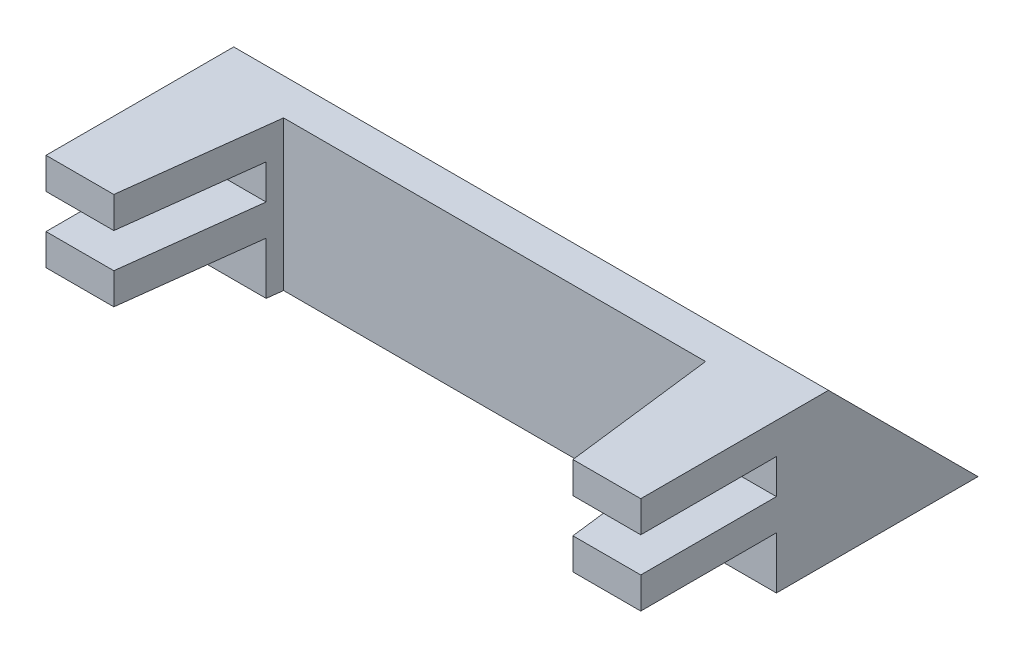
ISO-10303-21;
HEADER;
FILE_DESCRIPTION(('STEP AP214'),'2;1');
FILE_NAME('part.step','',(''),(''),'','','');
FILE_SCHEMA(('AUTOMOTIVE_DESIGN { 1 0 10303 214 1 1 1 1 }'));
ENDSEC;
DATA;
#1=APPLICATION_CONTEXT('core data for automotive mechanical design processes');
#2=APPLICATION_PROTOCOL_DEFINITION('international standard','automotive_design',2000,#1);
#3=PRODUCT_CONTEXT('',#1,'mechanical');
#4=PRODUCT('Part','Part','',(#3));
#5=PRODUCT_RELATED_PRODUCT_CATEGORY('part','',(#4));
#6=PRODUCT_DEFINITION_FORMATION('','',#4);
#7=PRODUCT_DEFINITION_CONTEXT('part definition',#1,'design');
#8=PRODUCT_DEFINITION('design','',#6,#7);
#9=PRODUCT_DEFINITION_SHAPE('','',#8);
#10=(LENGTH_UNIT() NAMED_UNIT(*) SI_UNIT(.MILLI.,.METRE.));
#11=(NAMED_UNIT(*) PLANE_ANGLE_UNIT() SI_UNIT($,.RADIAN.));
#12=(NAMED_UNIT(*) SI_UNIT($,.STERADIAN.) SOLID_ANGLE_UNIT());
#13=UNCERTAINTY_MEASURE_WITH_UNIT(LENGTH_MEASURE(1.E-05),#10,'distance_accuracy_value','');
#14=(GEOMETRIC_REPRESENTATION_CONTEXT(3) GLOBAL_UNCERTAINTY_ASSIGNED_CONTEXT((#13)) GLOBAL_UNIT_ASSIGNED_CONTEXT((#10,
#11,#12)) REPRESENTATION_CONTEXT('',''));
#15=CARTESIAN_POINT('',(0.,0.,0.));
#16=DIRECTION('',(0.,0.,1.));
#17=DIRECTION('',(1.,0.,0.));
#18=AXIS2_PLACEMENT_3D('',#15,#16,#17);
#19=CARTESIAN_POINT('',(-57.,5.,0.));
#20=DIRECTION('',(0.,0.,1.));
#21=DIRECTION('',(0.,-1.,0.));
#22=AXIS2_PLACEMENT_3D('',#19,#20,#21);
#23=PLANE('',#22);
#24=DIRECTION('',(0.,1.,0.));
#25=VECTOR('',#24,1.);
#26=CARTESIAN_POINT('',(-48.9038007082622,-0.00100000000000299,0.));
#27=LINE('',#26,#25);
#28=CARTESIAN_POINT('',(-48.9038007082622,0.,0.));
#29=VERTEX_POINT('',#28);
#30=CARTESIAN_POINT('',(-48.9038007082622,5.,0.));
#31=VERTEX_POINT('',#30);
#32=EDGE_CURVE('E360',#29,#31,#27,.T.);
#33=ORIENTED_EDGE('',*,*,#32,.T.);
#34=DIRECTION('',(1.,0.,0.));
#35=VECTOR('',#34,1.);
#36=CARTESIAN_POINT('',(-57.,5.,0.));
#37=LINE('',#36,#35);
#38=CARTESIAN_POINT('',(-57.,5.,0.));
#39=VERTEX_POINT('',#38);
#40=EDGE_CURVE('E198',#39,#31,#37,.T.);
#41=ORIENTED_EDGE('',*,*,#40,.F.);
#42=DIRECTION('',(0.,-1.,0.));
#43=VECTOR('',#42,1.);
#44=CARTESIAN_POINT('',(-57.,5.,0.));
#45=LINE('',#44,#43);
#46=CARTESIAN_POINT('',(-57.,0.,0.));
#47=VERTEX_POINT('',#46);
#48=EDGE_CURVE('E154',#39,#47,#45,.T.);
#49=ORIENTED_EDGE('',*,*,#48,.T.);
#50=DIRECTION('',(1.,0.,0.));
#51=VECTOR('',#50,1.);
#52=CARTESIAN_POINT('',(-57.,0.,0.));
#53=LINE('',#52,#51);
#54=EDGE_CURVE('E11',#47,#29,#53,.T.);
#55=ORIENTED_EDGE('',*,*,#54,.T.);
#56=EDGE_LOOP('',(#33,#41,#49,#55));
#57=FACE_BOUND('',#56,.T.);
#58=ADVANCED_FACE('F35',(#57),#23,.T.);
#59=CARTESIAN_POINT('',(-57.,5.,13.));
#60=DIRECTION('',(0.,-1.,0.));
#61=DIRECTION('',(0.,0.,-1.));
#62=AXIS2_PLACEMENT_3D('',#59,#60,#61);
#63=PLANE('',#62);
#64=DIRECTION('',(-0.121869343405151,0.,0.992546151641322));
#65=VECTOR('',#64,1.);
#66=CARTESIAN_POINT('',(-48.7208517125169,5.,-1.48999999999984));
#67=LINE('',#66,#65);
#68=CARTESIAN_POINT('',(-50.5,5.,13.));
#69=VERTEX_POINT('',#68);
#70=EDGE_CURVE('E140',#31,#69,#67,.T.);
#71=ORIENTED_EDGE('',*,*,#70,.T.);
#72=DIRECTION('',(1.,0.,0.));
#73=VECTOR('',#72,1.);
#74=CARTESIAN_POINT('',(-57.,5.,13.));
#75=LINE('',#74,#73);
#76=CARTESIAN_POINT('',(-57.,5.,13.));
#77=VERTEX_POINT('',#76);
#78=EDGE_CURVE('E132',#77,#69,#75,.T.);
#79=ORIENTED_EDGE('',*,*,#78,.F.);
#80=DIRECTION('',(0.,0.,-1.));
#81=VECTOR('',#80,1.);
#82=CARTESIAN_POINT('',(-57.,5.,13.));
#83=LINE('',#82,#81);
#84=EDGE_CURVE('E136',#77,#39,#83,.T.);
#85=ORIENTED_EDGE('',*,*,#84,.T.);
#86=ORIENTED_EDGE('',*,*,#40,.T.);
#87=EDGE_LOOP('',(#71,#79,#85,#86));
#88=FACE_BOUND('',#87,.T.);
#89=ADVANCED_FACE('F134',(#88),#63,.T.);
#90=CARTESIAN_POINT('',(-57.,8.,13.));
#91=DIRECTION('',(0.,0.,1.));
#92=DIRECTION('',(0.,-1.,0.));
#93=AXIS2_PLACEMENT_3D('',#90,#91,#92);
#94=PLANE('',#93);
#95=DIRECTION('',(0.,1.,0.));
#96=VECTOR('',#95,1.);
#97=CARTESIAN_POINT('',(-50.5,-0.00100000000000447,13.));
#98=LINE('',#97,#96);
#99=CARTESIAN_POINT('',(-50.5,8.,13.));
#100=VERTEX_POINT('',#99);
#101=EDGE_CURVE('E332',#69,#100,#98,.T.);
#102=ORIENTED_EDGE('',*,*,#101,.T.);
#103=DIRECTION('',(1.,0.,0.));
#104=VECTOR('',#103,1.);
#105=CARTESIAN_POINT('',(-57.,8.,13.));
#106=LINE('',#105,#104);
#107=CARTESIAN_POINT('',(-57.,8.,13.));
#108=VERTEX_POINT('',#107);
#109=EDGE_CURVE('E158',#108,#100,#106,.T.);
#110=ORIENTED_EDGE('',*,*,#109,.F.);
#111=DIRECTION('',(0.,-1.,0.));
#112=VECTOR('',#111,1.);
#113=CARTESIAN_POINT('',(-57.,8.,13.));
#114=LINE('',#113,#112);
#115=EDGE_CURVE('E151',#108,#77,#114,.T.);
#116=ORIENTED_EDGE('',*,*,#115,.T.);
#117=ORIENTED_EDGE('',*,*,#78,.T.);
#118=EDGE_LOOP('',(#102,#110,#116,#117));
#119=FACE_BOUND('',#118,.T.);
#120=ADVANCED_FACE('F156',(#119),#94,.T.);
#121=CARTESIAN_POINT('',(-57.,8.,0.));
#122=DIRECTION('',(0.,1.,0.));
#123=DIRECTION('',(0.,0.,1.));
#124=AXIS2_PLACEMENT_3D('',#121,#122,#123);
#125=PLANE('',#124);
#126=DIRECTION('',(0.121869343405151,0.,-0.992546151641322));
#127=VECTOR('',#126,1.);
#128=CARTESIAN_POINT('',(-48.7208517125169,8.,-1.48999999999984));
#129=LINE('',#128,#127);
#130=CARTESIAN_POINT('',(-48.9038007082622,8.,0.));
#131=VERTEX_POINT('',#130);
#132=EDGE_CURVE('E364',#100,#131,#129,.T.);
#133=ORIENTED_EDGE('',*,*,#132,.T.);
#134=DIRECTION('',(1.,0.,0.));
#135=VECTOR('',#134,1.);
#136=CARTESIAN_POINT('',(-57.,8.,0.));
#137=LINE('',#136,#135);
#138=CARTESIAN_POINT('',(-57.,8.,0.));
#139=VERTEX_POINT('',#138);
#140=EDGE_CURVE('E202',#139,#131,#137,.T.);
#141=ORIENTED_EDGE('',*,*,#140,.F.);
#142=DIRECTION('',(0.,0.,1.));
#143=VECTOR('',#142,1.);
#144=CARTESIAN_POINT('',(-57.,8.,0.));
#145=LINE('',#144,#143);
#146=EDGE_CURVE('E159',#139,#108,#145,.T.);
#147=ORIENTED_EDGE('',*,*,#146,.T.);
#148=ORIENTED_EDGE('',*,*,#109,.T.);
#149=EDGE_LOOP('',(#133,#141,#147,#148));
#150=FACE_BOUND('',#149,.T.);
#151=ADVANCED_FACE('F371',(#150),#125,.T.);
#152=CARTESIAN_POINT('',(-57.,11.33,0.));
#153=DIRECTION('',(0.,0.,1.));
#154=DIRECTION('',(0.,-1.,0.));
#155=AXIS2_PLACEMENT_3D('',#152,#153,#154);
#156=PLANE('',#155);
#157=DIRECTION('',(0.,1.,0.));
#158=VECTOR('',#157,1.);
#159=CARTESIAN_POINT('',(-48.9038007082622,-0.00100000000000292,0.));
#160=LINE('',#159,#158);
#161=CARTESIAN_POINT('',(-48.9038007082622,11.33,0.));
#162=VERTEX_POINT('',#161);
#163=EDGE_CURVE('E367',#131,#162,#160,.T.);
#164=ORIENTED_EDGE('',*,*,#163,.T.);
#165=DIRECTION('',(1.,0.,0.));
#166=VECTOR('',#165,1.);
#167=CARTESIAN_POINT('',(-57.,11.33,0.));
#168=LINE('',#167,#166);
#169=CARTESIAN_POINT('',(-57.,11.33,0.));
#170=VERTEX_POINT('',#169);
#171=EDGE_CURVE('E206',#170,#162,#168,.T.);
#172=ORIENTED_EDGE('',*,*,#171,.F.);
#173=DIRECTION('',(0.,-1.,0.));
#174=VECTOR('',#173,1.);
#175=CARTESIAN_POINT('',(-57.,11.33,0.));
#176=LINE('',#175,#174);
#177=EDGE_CURVE('E161',#170,#139,#176,.T.);
#178=ORIENTED_EDGE('',*,*,#177,.T.);
#179=ORIENTED_EDGE('',*,*,#140,.T.);
#180=EDGE_LOOP('',(#164,#172,#178,#179));
#181=FACE_BOUND('',#180,.T.);
#182=ADVANCED_FACE('F263',(#181),#156,.T.);
#183=CARTESIAN_POINT('',(-57.,11.33,13.));
#184=DIRECTION('',(0.,-1.,0.));
#185=DIRECTION('',(0.,0.,-1.));
#186=AXIS2_PLACEMENT_3D('',#183,#184,#185);
#187=PLANE('',#186);
#188=DIRECTION('',(-0.121869343405151,0.,0.992546151641322));
#189=VECTOR('',#188,1.);
#190=CARTESIAN_POINT('',(-48.7208517125169,11.33,-1.48999999999984));
#191=LINE('',#190,#189);
#192=CARTESIAN_POINT('',(-50.5,11.33,13.));
#193=VERTEX_POINT('',#192);
#194=EDGE_CURVE('E273',#162,#193,#191,.T.);
#195=ORIENTED_EDGE('',*,*,#194,.T.);
#196=DIRECTION('',(1.,0.,0.));
#197=VECTOR('',#196,1.);
#198=CARTESIAN_POINT('',(-57.,11.33,13.));
#199=LINE('',#198,#197);
#200=CARTESIAN_POINT('',(-57.,11.33,13.));
#201=VERTEX_POINT('',#200);
#202=EDGE_CURVE('E210',#201,#193,#199,.T.);
#203=ORIENTED_EDGE('',*,*,#202,.F.);
#204=DIRECTION('',(0.,0.,-1.));
#205=VECTOR('',#204,1.);
#206=CARTESIAN_POINT('',(-57.,11.33,13.));
#207=LINE('',#206,#205);
#208=EDGE_CURVE('E257',#201,#170,#207,.T.);
#209=ORIENTED_EDGE('',*,*,#208,.T.);
#210=ORIENTED_EDGE('',*,*,#171,.T.);
#211=EDGE_LOOP('',(#195,#203,#209,#210));
#212=FACE_BOUND('',#211,.T.);
#213=ADVANCED_FACE('F269',(#212),#187,.T.);
#214=CARTESIAN_POINT('',(-57.,14.33,13.));
#215=DIRECTION('',(0.,0.,1.));
#216=DIRECTION('',(1.,0.,0.));
#217=AXIS2_PLACEMENT_3D('',#214,#215,#216);
#218=PLANE('',#217);
#219=CARTESIAN_POINT('',(-50.5,14.33,13.));
#220=VERTEX_POINT('',#219);
#221=EDGE_CURVE('E279',#193,#220,#98,.T.);
#222=ORIENTED_EDGE('',*,*,#221,.T.);
#223=DIRECTION('',(1.,0.,0.));
#224=VECTOR('',#223,1.);
#225=CARTESIAN_POINT('',(-57.,14.33,13.));
#226=LINE('',#225,#224);
#227=CARTESIAN_POINT('',(-57.,14.33,13.));
#228=VERTEX_POINT('',#227);
#229=EDGE_CURVE('E214',#228,#220,#226,.T.);
#230=ORIENTED_EDGE('',*,*,#229,.F.);
#231=DIRECTION('',(0.,-1.,0.));
#232=VECTOR('',#231,1.);
#233=CARTESIAN_POINT('',(-57.,14.33,13.));
#234=LINE('',#233,#232);
#235=EDGE_CURVE('E254',#228,#201,#234,.T.);
#236=ORIENTED_EDGE('',*,*,#235,.T.);
#237=ORIENTED_EDGE('',*,*,#202,.T.);
#238=EDGE_LOOP('',(#222,#230,#236,#237));
#239=FACE_BOUND('',#238,.T.);
#240=ADVANCED_FACE('F276',(#239),#218,.T.);
#241=CARTESIAN_POINT('',(-57.,0.,0.));
#242=DIRECTION('',(0.,-1.,0.));
#243=DIRECTION('',(0.,0.,-1.));
#244=AXIS2_PLACEMENT_3D('',#241,#242,#243);
#245=PLANE('',#244);
#246=DIRECTION('',(-0.121869343405151,0.,0.992546151641322));
#247=VECTOR('',#246,1.);
#248=CARTESIAN_POINT('',(-48.7208517125169,0.,-1.48999999999984));
#249=LINE('',#248,#247);
#250=CARTESIAN_POINT('',(-48.7208517125169,0.,-1.48999999999984));
#251=VERTEX_POINT('',#250);
#252=EDGE_CURVE('E355',#251,#29,#249,.T.);
#253=ORIENTED_EDGE('',*,*,#252,.T.);
#254=ORIENTED_EDGE('',*,*,#54,.F.);
#255=DIRECTION('',(0.,0.,-1.));
#256=VECTOR('',#255,1.);
#257=CARTESIAN_POINT('',(-57.,0.,0.));
#258=LINE('',#257,#256);
#259=CARTESIAN_POINT('',(-57.,0.,-19.32));
#260=VERTEX_POINT('',#259);
#261=EDGE_CURVE('E196',#47,#260,#258,.T.);
#262=ORIENTED_EDGE('',*,*,#261,.T.);
#263=DIRECTION('',(1.,0.,0.));
#264=VECTOR('',#263,1.);
#265=CARTESIAN_POINT('',(-57.,0.,-19.32));
#266=LINE('',#265,#264);
#267=CARTESIAN_POINT('',(0.,0.,-19.32));
#268=VERTEX_POINT('',#267);
#269=EDGE_CURVE('E39',#260,#268,#266,.T.);
#270=ORIENTED_EDGE('',*,*,#269,.T.);
#271=DIRECTION('',(0.,0.,-1.));
#272=VECTOR('',#271,1.);
#273=CARTESIAN_POINT('',(0.,0.,0.));
#274=LINE('',#273,#272);
#275=CARTESIAN_POINT('',(0.,0.,0.));
#276=VERTEX_POINT('',#275);
#277=EDGE_CURVE('E166',#276,#268,#274,.T.);
#278=ORIENTED_EDGE('',*,*,#277,.F.);
#279=CARTESIAN_POINT('',(-8.09619929173782,0.,0.));
#280=VERTEX_POINT('',#279);
#281=EDGE_CURVE('E44',#280,#276,#53,.T.);
#282=ORIENTED_EDGE('',*,*,#281,.F.);
#283=DIRECTION('',(-0.121869343405151,0.,-0.992546151641322));
#284=VECTOR('',#283,1.);
#285=CARTESIAN_POINT('',(-6.5,0.,13.));
#286=LINE('',#285,#284);
#287=CARTESIAN_POINT('',(-8.27914828748312,0.,-1.48999999999984));
#288=VERTEX_POINT('',#287);
#289=EDGE_CURVE('E170',#280,#288,#286,.T.);
#290=ORIENTED_EDGE('',*,*,#289,.T.);
#291=DIRECTION('',(-1.,0.,0.));
#292=VECTOR('',#291,1.);
#293=CARTESIAN_POINT('',(-8.27914828748312,0.,-1.48999999999984));
#294=LINE('',#293,#292);
#295=EDGE_CURVE('E357',#288,#251,#294,.T.);
#296=ORIENTED_EDGE('',*,*,#295,.T.);
#297=EDGE_LOOP('',(#253,#254,#262,#270,#278,#282,#290,#296));
#298=FACE_BOUND('',#297,.T.);
#299=ADVANCED_FACE('F37',(#298),#245,.T.);
#300=DIRECTION('',(0.,-1.,0.));
#301=VECTOR('',#300,1.);
#302=CARTESIAN_POINT('',(-8.09619929173781,-0.00100000000000224,0.));
#303=LINE('',#302,#301);
#304=CARTESIAN_POINT('',(-8.09619929173781,5.,0.));
#305=VERTEX_POINT('',#304);
#306=EDGE_CURVE('E227',#305,#280,#303,.T.);
#307=ORIENTED_EDGE('',*,*,#306,.T.);
#308=ORIENTED_EDGE('',*,*,#281,.T.);
#309=DIRECTION('',(0.,-1.,0.));
#310=VECTOR('',#309,1.);
#311=CARTESIAN_POINT('',(0.,5.,0.));
#312=LINE('',#311,#310);
#313=CARTESIAN_POINT('',(0.,5.,0.));
#314=VERTEX_POINT('',#313);
#315=EDGE_CURVE('E194',#314,#276,#312,.T.);
#316=ORIENTED_EDGE('',*,*,#315,.F.);
#317=EDGE_CURVE('E144',#305,#314,#37,.T.);
#318=ORIENTED_EDGE('',*,*,#317,.F.);
#319=EDGE_LOOP('',(#307,#308,#316,#318));
#320=FACE_BOUND('',#319,.T.);
#321=ADVANCED_FACE('F224',(#320),#23,.T.);
#322=DIRECTION('',(-0.121869343405151,0.,-0.992546151641322));
#323=VECTOR('',#322,1.);
#324=CARTESIAN_POINT('',(-6.5,5.,13.));
#325=LINE('',#324,#323);
#326=CARTESIAN_POINT('',(-6.50000000000001,5.,13.));
#327=VERTEX_POINT('',#326);
#328=EDGE_CURVE('E234',#327,#305,#325,.T.);
#329=ORIENTED_EDGE('',*,*,#328,.T.);
#330=ORIENTED_EDGE('',*,*,#317,.T.);
#331=DIRECTION('',(0.,0.,-1.));
#332=VECTOR('',#331,1.);
#333=CARTESIAN_POINT('',(0.,5.,13.));
#334=LINE('',#333,#332);
#335=CARTESIAN_POINT('',(0.,5.,13.));
#336=VERTEX_POINT('',#335);
#337=EDGE_CURVE('E191',#336,#314,#334,.T.);
#338=ORIENTED_EDGE('',*,*,#337,.F.);
#339=EDGE_CURVE('E145',#327,#336,#75,.T.);
#340=ORIENTED_EDGE('',*,*,#339,.F.);
#341=EDGE_LOOP('',(#329,#330,#338,#340));
#342=FACE_BOUND('',#341,.T.);
#343=ADVANCED_FACE('F231',(#342),#63,.T.);
#344=DIRECTION('',(0.,1.,0.));
#345=VECTOR('',#344,1.);
#346=CARTESIAN_POINT('',(-6.5,-0.00100000000000447,13.));
#347=LINE('',#346,#345);
#348=CARTESIAN_POINT('',(-6.5,8.,13.));
#349=VERTEX_POINT('',#348);
#350=EDGE_CURVE('E340',#327,#349,#347,.T.);
#351=ORIENTED_EDGE('',*,*,#350,.F.);
#352=ORIENTED_EDGE('',*,*,#339,.T.);
#353=DIRECTION('',(0.,-1.,0.));
#354=VECTOR('',#353,1.);
#355=CARTESIAN_POINT('',(0.,8.,13.));
#356=LINE('',#355,#354);
#357=CARTESIAN_POINT('',(0.,8.,13.));
#358=VERTEX_POINT('',#357);
#359=EDGE_CURVE('E188',#358,#336,#356,.T.);
#360=ORIENTED_EDGE('',*,*,#359,.F.);
#361=EDGE_CURVE('E201',#349,#358,#106,.T.);
#362=ORIENTED_EDGE('',*,*,#361,.F.);
#363=EDGE_LOOP('',(#351,#352,#360,#362));
#364=FACE_BOUND('',#363,.T.);
#365=ADVANCED_FACE('F381',(#364),#94,.T.);
#366=DIRECTION('',(0.121869343405151,0.,0.992546151641322));
#367=VECTOR('',#366,1.);
#368=CARTESIAN_POINT('',(-6.5,8.,13.));
#369=LINE('',#368,#367);
#370=CARTESIAN_POINT('',(-8.09619929173782,8.,0.));
#371=VERTEX_POINT('',#370);
#372=EDGE_CURVE('E238',#371,#349,#369,.T.);
#373=ORIENTED_EDGE('',*,*,#372,.T.);
#374=ORIENTED_EDGE('',*,*,#361,.T.);
#375=DIRECTION('',(0.,0.,1.));
#376=VECTOR('',#375,1.);
#377=CARTESIAN_POINT('',(0.,8.,0.));
#378=LINE('',#377,#376);
#379=CARTESIAN_POINT('',(0.,8.,0.));
#380=VERTEX_POINT('',#379);
#381=EDGE_CURVE('E185',#380,#358,#378,.T.);
#382=ORIENTED_EDGE('',*,*,#381,.F.);
#383=EDGE_CURVE('E205',#371,#380,#137,.T.);
#384=ORIENTED_EDGE('',*,*,#383,.F.);
#385=EDGE_LOOP('',(#373,#374,#382,#384));
#386=FACE_BOUND('',#385,.T.);
#387=ADVANCED_FACE('F374',(#386),#125,.T.);
#388=DIRECTION('',(0.,-1.,0.));
#389=VECTOR('',#388,1.);
#390=CARTESIAN_POINT('',(-8.09619929173781,-0.00100000000000289,0.));
#391=LINE('',#390,#389);
#392=CARTESIAN_POINT('',(-8.09619929173781,11.33,0.));
#393=VERTEX_POINT('',#392);
#394=EDGE_CURVE('E242',#393,#371,#391,.T.);
#395=ORIENTED_EDGE('',*,*,#394,.T.);
#396=ORIENTED_EDGE('',*,*,#383,.T.);
#397=DIRECTION('',(0.,-1.,0.));
#398=VECTOR('',#397,1.);
#399=CARTESIAN_POINT('',(0.,11.33,0.));
#400=LINE('',#399,#398);
#401=CARTESIAN_POINT('',(0.,11.33,0.));
#402=VERTEX_POINT('',#401);
#403=EDGE_CURVE('E182',#402,#380,#400,.T.);
#404=ORIENTED_EDGE('',*,*,#403,.F.);
#405=EDGE_CURVE('E209',#393,#402,#168,.T.);
#406=ORIENTED_EDGE('',*,*,#405,.F.);
#407=EDGE_LOOP('',(#395,#396,#404,#406));
#408=FACE_BOUND('',#407,.T.);
#409=ADVANCED_FACE('F334',(#408),#156,.T.);
#410=DIRECTION('',(-0.121869343405151,0.,-0.992546151641322));
#411=VECTOR('',#410,1.);
#412=CARTESIAN_POINT('',(-6.5,11.33,13.));
#413=LINE('',#412,#411);
#414=CARTESIAN_POINT('',(-6.50000000000001,11.33,13.));
#415=VERTEX_POINT('',#414);
#416=EDGE_CURVE('E323',#415,#393,#413,.T.);
#417=ORIENTED_EDGE('',*,*,#416,.T.);
#418=ORIENTED_EDGE('',*,*,#405,.T.);
#419=DIRECTION('',(0.,0.,-1.));
#420=VECTOR('',#419,1.);
#421=CARTESIAN_POINT('',(0.,11.33,13.));
#422=LINE('',#421,#420);
#423=CARTESIAN_POINT('',(0.,11.33,13.));
#424=VERTEX_POINT('',#423);
#425=EDGE_CURVE('E179',#424,#402,#422,.T.);
#426=ORIENTED_EDGE('',*,*,#425,.F.);
#427=EDGE_CURVE('E213',#415,#424,#199,.T.);
#428=ORIENTED_EDGE('',*,*,#427,.F.);
#429=EDGE_LOOP('',(#417,#418,#426,#428));
#430=FACE_BOUND('',#429,.T.);
#431=ADVANCED_FACE('F329',(#430),#187,.T.);
#432=CARTESIAN_POINT('',(-6.50000000000001,14.33,13.));
#433=VERTEX_POINT('',#432);
#434=EDGE_CURVE('E52',#415,#433,#347,.T.);
#435=ORIENTED_EDGE('',*,*,#434,.F.);
#436=ORIENTED_EDGE('',*,*,#427,.T.);
#437=DIRECTION('',(0.,-1.,0.));
#438=VECTOR('',#437,1.);
#439=CARTESIAN_POINT('',(0.,14.33,13.));
#440=LINE('',#439,#438);
#441=CARTESIAN_POINT('',(0.,14.33,13.));
#442=VERTEX_POINT('',#441);
#443=EDGE_CURVE('E176',#442,#424,#440,.T.);
#444=ORIENTED_EDGE('',*,*,#443,.F.);
#445=EDGE_CURVE('E216',#433,#442,#226,.T.);
#446=ORIENTED_EDGE('',*,*,#445,.F.);
#447=EDGE_LOOP('',(#435,#436,#444,#446));
#448=FACE_BOUND('',#447,.T.);
#449=ADVANCED_FACE('F339',(#448),#218,.T.);
#450=CARTESIAN_POINT('',(-57.,14.33,-4.98999999999984));
#451=DIRECTION('',(0.,1.,0.));
#452=DIRECTION('',(0.,0.,1.));
#453=AXIS2_PLACEMENT_3D('',#450,#451,#452);
#454=PLANE('',#453);
#455=DIRECTION('',(-0.121869343405151,0.,0.992546151641322));
#456=VECTOR('',#455,1.);
#457=CARTESIAN_POINT('',(-48.7208517125169,14.33,-1.48999999999983));
#458=LINE('',#457,#456);
#459=CARTESIAN_POINT('',(-48.7208517125169,14.33,-1.48999999999983));
#460=VERTEX_POINT('',#459);
#461=EDGE_CURVE('E341',#460,#220,#458,.T.);
#462=ORIENTED_EDGE('',*,*,#461,.F.);
#463=DIRECTION('',(-1.,0.,0.));
#464=VECTOR('',#463,1.);
#465=CARTESIAN_POINT('',(-8.27914828748312,14.33,-1.48999999999983));
#466=LINE('',#465,#464);
#467=CARTESIAN_POINT('',(-8.27914828748312,14.33,-1.48999999999983));
#468=VERTEX_POINT('',#467);
#469=EDGE_CURVE('E344',#468,#460,#466,.T.);
#470=ORIENTED_EDGE('',*,*,#469,.F.);
#471=DIRECTION('',(-0.121869343405151,0.,-0.992546151641322));
#472=VECTOR('',#471,1.);
#473=CARTESIAN_POINT('',(-6.5,14.33,13.));
#474=LINE('',#473,#472);
#475=EDGE_CURVE('E353',#433,#468,#474,.T.);
#476=ORIENTED_EDGE('',*,*,#475,.F.);
#477=ORIENTED_EDGE('',*,*,#445,.T.);
#478=DIRECTION('',(0.,0.,1.));
#479=VECTOR('',#478,1.);
#480=CARTESIAN_POINT('',(0.,14.33,-4.98999999999984));
#481=LINE('',#480,#479);
#482=CARTESIAN_POINT('',(0.,14.33,-4.98999999999984));
#483=VERTEX_POINT('',#482);
#484=EDGE_CURVE('E173',#483,#442,#481,.T.);
#485=ORIENTED_EDGE('',*,*,#484,.F.);
#486=DIRECTION('',(1.,0.,0.));
#487=VECTOR('',#486,1.);
#488=CARTESIAN_POINT('',(-57.,14.33,-4.98999999999984));
#489=LINE('',#488,#487);
#490=CARTESIAN_POINT('',(-57.,14.33,-4.98999999999984));
#491=VERTEX_POINT('',#490);
#492=EDGE_CURVE('E217',#491,#483,#489,.T.);
#493=ORIENTED_EDGE('',*,*,#492,.F.);
#494=DIRECTION('',(0.,0.,1.));
#495=VECTOR('',#494,1.);
#496=CARTESIAN_POINT('',(-57.,14.33,-4.98999999999984));
#497=LINE('',#496,#495);
#498=EDGE_CURVE('E251',#491,#228,#497,.T.);
#499=ORIENTED_EDGE('',*,*,#498,.T.);
#500=ORIENTED_EDGE('',*,*,#229,.T.);
#501=EDGE_LOOP('',(#462,#470,#476,#477,#485,#493,#499,#500));
#502=FACE_BOUND('',#501,.T.);
#503=ADVANCED_FACE('F407',(#502),#454,.T.);
#504=CARTESIAN_POINT('',(-57.,0.,-19.32));
#505=DIRECTION('',(0.,0.707106781186551,-0.707106781186544));
#506=DIRECTION('',(0.,0.707106781186544,0.707106781186551));
#507=AXIS2_PLACEMENT_3D('',#504,#505,#506);
#508=PLANE('',#507);
#509=DIRECTION('',(0.,0.707106781186544,0.707106781186551));
#510=VECTOR('',#509,1.);
#511=CARTESIAN_POINT('',(0.,0.,-19.32));
#512=LINE('',#511,#510);
#513=EDGE_CURVE('E169',#268,#483,#512,.T.);
#514=ORIENTED_EDGE('',*,*,#513,.F.);
#515=ORIENTED_EDGE('',*,*,#269,.F.);
#516=DIRECTION('',(0.,0.707106781186544,0.707106781186551));
#517=VECTOR('',#516,1.);
#518=CARTESIAN_POINT('',(-57.,0.,-19.32));
#519=LINE('',#518,#517);
#520=EDGE_CURVE('E249',#260,#491,#519,.T.);
#521=ORIENTED_EDGE('',*,*,#520,.T.);
#522=ORIENTED_EDGE('',*,*,#492,.T.);
#523=EDGE_LOOP('',(#514,#515,#521,#522));
#524=FACE_BOUND('',#523,.T.);
#525=ADVANCED_FACE('F219',(#524),#508,.T.);
#526=CARTESIAN_POINT('',(-57.,0.,0.));
#527=DIRECTION('',(-1.,0.,0.));
#528=DIRECTION('',(0.,0.,1.));
#529=AXIS2_PLACEMENT_3D('',#526,#527,#528);
#530=PLANE('',#529);
#531=ORIENTED_EDGE('',*,*,#261,.F.);
#532=ORIENTED_EDGE('',*,*,#48,.F.);
#533=ORIENTED_EDGE('',*,*,#84,.F.);
#534=ORIENTED_EDGE('',*,*,#115,.F.);
#535=ORIENTED_EDGE('',*,*,#146,.F.);
#536=ORIENTED_EDGE('',*,*,#177,.F.);
#537=ORIENTED_EDGE('',*,*,#208,.F.);
#538=ORIENTED_EDGE('',*,*,#235,.F.);
#539=ORIENTED_EDGE('',*,*,#498,.F.);
#540=ORIENTED_EDGE('',*,*,#520,.F.);
#541=EDGE_LOOP('',(#531,#532,#533,#534,#535,#536,#537,#538,#539,#540));
#542=FACE_BOUND('',#541,.T.);
#543=ADVANCED_FACE('F149',(#542),#530,.T.);
#544=CARTESIAN_POINT('',(0.,0.,0.));
#545=DIRECTION('',(-1.,0.,0.));
#546=DIRECTION('',(0.,0.,1.));
#547=AXIS2_PLACEMENT_3D('',#544,#545,#546);
#548=PLANE('',#547);
#549=ORIENTED_EDGE('',*,*,#277,.T.);
#550=ORIENTED_EDGE('',*,*,#513,.T.);
#551=ORIENTED_EDGE('',*,*,#484,.T.);
#552=ORIENTED_EDGE('',*,*,#443,.T.);
#553=ORIENTED_EDGE('',*,*,#425,.T.);
#554=ORIENTED_EDGE('',*,*,#403,.T.);
#555=ORIENTED_EDGE('',*,*,#381,.T.);
#556=ORIENTED_EDGE('',*,*,#359,.T.);
#557=ORIENTED_EDGE('',*,*,#337,.T.);
#558=ORIENTED_EDGE('',*,*,#315,.T.);
#559=EDGE_LOOP('',(#549,#550,#551,#552,#553,#554,#555,#556,#557,#558));
#560=FACE_BOUND('',#559,.T.);
#561=ADVANCED_FACE('F221',(#560),#548,.F.);
#562=CARTESIAN_POINT('',(-48.7208517125169,-0.00100000000000273,-1.48999999999984));
#563=DIRECTION('',(-0.992546151641322,0.,-0.121869343405151));
#564=DIRECTION('',(-0.121869343405151,0.,0.992546151641322));
#565=AXIS2_PLACEMENT_3D('',#562,#563,#564);
#566=PLANE('',#565);
#567=DIRECTION('',(0.,1.,0.));
#568=VECTOR('',#567,1.);
#569=CARTESIAN_POINT('',(-48.7208517125169,-0.00100000000000273,-1.48999999999984));
#570=LINE('',#569,#568);
#571=EDGE_CURVE('E348',#251,#460,#570,.T.);
#572=ORIENTED_EDGE('',*,*,#571,.T.);
#573=ORIENTED_EDGE('',*,*,#461,.T.);
#574=ORIENTED_EDGE('',*,*,#221,.F.);
#575=ORIENTED_EDGE('',*,*,#194,.F.);
#576=ORIENTED_EDGE('',*,*,#163,.F.);
#577=ORIENTED_EDGE('',*,*,#132,.F.);
#578=ORIENTED_EDGE('',*,*,#101,.F.);
#579=ORIENTED_EDGE('',*,*,#70,.F.);
#580=ORIENTED_EDGE('',*,*,#32,.F.);
#581=ORIENTED_EDGE('',*,*,#252,.F.);
#582=EDGE_LOOP('',(#572,#573,#574,#575,#576,#577,#578,#579,#580,#581));
#583=FACE_BOUND('',#582,.T.);
#584=ADVANCED_FACE('F369',(#583),#566,.F.);
#585=CARTESIAN_POINT('',(-8.27914828748312,-0.00100000000000273,-1.48999999999984));
#586=DIRECTION('',(0.,0.,-1.));
#587=DIRECTION('',(0.,1.,0.));
#588=AXIS2_PLACEMENT_3D('',#585,#586,#587);
#589=PLANE('',#588);
#590=DIRECTION('',(0.,1.,0.));
#591=VECTOR('',#590,1.);
#592=CARTESIAN_POINT('',(-8.27914828748312,-0.00100000000000273,-1.48999999999984));
#593=LINE('',#592,#591);
#594=EDGE_CURVE('E343',#288,#468,#593,.T.);
#595=ORIENTED_EDGE('',*,*,#594,.T.);
#596=ORIENTED_EDGE('',*,*,#469,.T.);
#597=ORIENTED_EDGE('',*,*,#571,.F.);
#598=ORIENTED_EDGE('',*,*,#295,.F.);
#599=EDGE_LOOP('',(#595,#596,#597,#598));
#600=FACE_BOUND('',#599,.T.);
#601=ADVANCED_FACE('F515',(#600),#589,.F.);
#602=CARTESIAN_POINT('',(-6.5,-0.00100000000000447,13.));
#603=DIRECTION('',(0.992546151641322,0.,-0.121869343405151));
#604=DIRECTION('',(-0.121869343405151,0.,-0.992546151641322));
#605=AXIS2_PLACEMENT_3D('',#602,#603,#604);
#606=PLANE('',#605);
#607=ORIENTED_EDGE('',*,*,#306,.F.);
#608=ORIENTED_EDGE('',*,*,#328,.F.);
#609=ORIENTED_EDGE('',*,*,#350,.T.);
#610=ORIENTED_EDGE('',*,*,#372,.F.);
#611=ORIENTED_EDGE('',*,*,#394,.F.);
#612=ORIENTED_EDGE('',*,*,#416,.F.);
#613=ORIENTED_EDGE('',*,*,#434,.T.);
#614=ORIENTED_EDGE('',*,*,#475,.T.);
#615=ORIENTED_EDGE('',*,*,#594,.F.);
#616=ORIENTED_EDGE('',*,*,#289,.F.);
#617=EDGE_LOOP('',(#607,#608,#609,#610,#611,#612,#613,#614,#615,#616));
#618=FACE_BOUND('',#617,.T.);
#619=ADVANCED_FACE('F322',(#618),#606,.F.);
#620=CLOSED_SHELL('',(#58,#89,#120,#151,#182,#213,#240,#299,#321,#343,#365,#387,#409,#431,#449,
#503,#525,#543,#561,#584,#601,#619));
#621=MANIFOLD_SOLID_BREP('B2',#620);
#622=ADVANCED_BREP_SHAPE_REPRESENTATION('',(#18,#621),#14);
#623=SHAPE_DEFINITION_REPRESENTATION(#9,#622);
ENDSEC;
END-ISO-10303-21;
